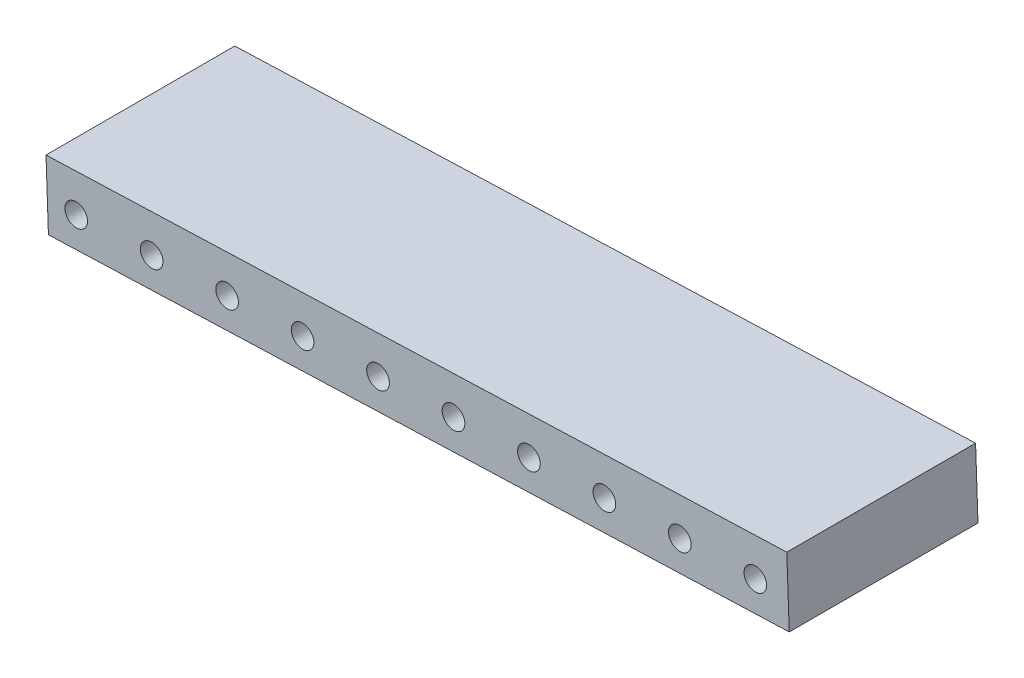
ISO-10303-21;
HEADER;
FILE_DESCRIPTION(('STEP AP214'),'2;1');
FILE_NAME('part.step','',(''),(''),'','','');
FILE_SCHEMA(('AUTOMOTIVE_DESIGN { 1 0 10303 214 1 1 1 1 }'));
ENDSEC;
DATA;
#1=APPLICATION_CONTEXT('core data for automotive mechanical design processes');
#2=APPLICATION_PROTOCOL_DEFINITION('international standard','automotive_design',2000,#1);
#3=PRODUCT_CONTEXT('',#1,'mechanical');
#4=PRODUCT('Part','Part','',(#3));
#5=PRODUCT_RELATED_PRODUCT_CATEGORY('part','',(#4));
#6=PRODUCT_DEFINITION_FORMATION('','',#4);
#7=PRODUCT_DEFINITION_CONTEXT('part definition',#1,'design');
#8=PRODUCT_DEFINITION('design','',#6,#7);
#9=PRODUCT_DEFINITION_SHAPE('','',#8);
#10=(LENGTH_UNIT() NAMED_UNIT(*) SI_UNIT(.MILLI.,.METRE.));
#11=(NAMED_UNIT(*) PLANE_ANGLE_UNIT() SI_UNIT($,.RADIAN.));
#12=(NAMED_UNIT(*) SI_UNIT($,.STERADIAN.) SOLID_ANGLE_UNIT());
#13=UNCERTAINTY_MEASURE_WITH_UNIT(LENGTH_MEASURE(1.E-05),#10,'distance_accuracy_value','');
#14=(GEOMETRIC_REPRESENTATION_CONTEXT(3) GLOBAL_UNCERTAINTY_ASSIGNED_CONTEXT((#13)) GLOBAL_UNIT_ASSIGNED_CONTEXT((#10,
#11,#12)) REPRESENTATION_CONTEXT('',''));
#15=CARTESIAN_POINT('',(0.,0.,0.));
#16=DIRECTION('',(0.,0.,1.));
#17=DIRECTION('',(1.,0.,0.));
#18=AXIS2_PLACEMENT_3D('',#15,#16,#17);
#19=CARTESIAN_POINT('',(-0.713375796178345,19.9745222929936,-5.));
#20=DIRECTION('',(-0.0356915305124125,0.99936285434755,0.));
#21=DIRECTION('',(-0.99936285434755,-0.0356915305124125,0.));
#22=AXIS2_PLACEMENT_3D('',#19,#20,#21);
#23=PLANE('',#22);
#24=DIRECTION('',(-0.99936285434755,-0.0356915305124125,0.));
#25=VECTOR('',#24,1.);
#26=CARTESIAN_POINT('',(-0.713375796178345,19.9745222929936,5.));
#27=LINE('',#26,#25);
#28=CARTESIAN_POINT('',(114.097813252607,24.0749219018788,5.));
#29=VERTEX_POINT('',#28);
#30=CARTESIAN_POINT('',(15.9876544347127,20.5709876583826,5.));
#31=VERTEX_POINT('',#30);
#32=EDGE_CURVE('E123',#29,#31,#27,.T.);
#33=ORIENTED_EDGE('',*,*,#32,.F.);
#34=DIRECTION('',(0.,0.,-1.));
#35=VECTOR('',#34,1.);
#36=CARTESIAN_POINT('',(114.097813252607,24.0749219018788,5.));
#37=LINE('',#36,#35);
#38=CARTESIAN_POINT('',(114.097813252607,24.0749219018788,-20.));
#39=VERTEX_POINT('',#38);
#40=EDGE_CURVE('E154',#29,#39,#37,.T.);
#41=ORIENTED_EDGE('',*,*,#40,.T.);
#42=DIRECTION('',(0.99936285434755,0.0356915305124126,0.));
#43=VECTOR('',#42,1.);
#44=CARTESIAN_POINT('',(15.9876544347127,20.5709876583826,-20.));
#45=LINE('',#44,#43);
#46=CARTESIAN_POINT('',(15.9876544347127,20.5709876583826,-20.));
#47=VERTEX_POINT('',#46);
#48=EDGE_CURVE('E228',#47,#39,#45,.T.);
#49=ORIENTED_EDGE('',*,*,#48,.F.);
#50=DIRECTION('',(0.,0.,1.));
#51=VECTOR('',#50,1.);
#52=CARTESIAN_POINT('',(15.9876544347127,20.5709876583826,0.));
#53=LINE('',#52,#51);
#54=EDGE_CURVE('E167',#47,#31,#53,.T.);
#55=ORIENTED_EDGE('',*,*,#54,.T.);
#56=EDGE_LOOP('',(#33,#41,#49,#55));
#57=FACE_BOUND('',#56,.T.);
#58=ADVANCED_FACE('F114',(#57),#23,.T.);
#59=CARTESIAN_POINT('',(-0.392152021566632,10.9802566038657,0.));
#60=DIRECTION('',(-0.0356915305124125,0.99936285434755,0.));
#61=DIRECTION('',(-0.99936285434755,-0.0356915305124125,0.));
#62=AXIS2_PLACEMENT_3D('',#59,#60,#61);
#63=PLANE('',#62);
#64=DIRECTION('',(0.,0.,-1.));
#65=VECTOR('',#64,1.);
#66=CARTESIAN_POINT('',(114.419037027218,15.0806562127509,5.));
#67=LINE('',#66,#65);
#68=CARTESIAN_POINT('',(114.419037027218,15.0806562127509,5.));
#69=VERTEX_POINT('',#68);
#70=CARTESIAN_POINT('',(114.419037027218,15.0806562127509,-20.));
#71=VERTEX_POINT('',#70);
#72=EDGE_CURVE('E130',#69,#71,#67,.T.);
#73=ORIENTED_EDGE('',*,*,#72,.F.);
#74=DIRECTION('',(-0.99936285434755,-0.0356915305124125,0.));
#75=VECTOR('',#74,1.);
#76=CARTESIAN_POINT('',(-0.392152021566632,10.9802566038657,5.));
#77=LINE('',#76,#75);
#78=CARTESIAN_POINT('',(16.3088782093244,11.5767219692547,5.));
#79=VERTEX_POINT('',#78);
#80=EDGE_CURVE('E163',#69,#79,#77,.T.);
#81=ORIENTED_EDGE('',*,*,#80,.T.);
#82=DIRECTION('',(0.,0.,1.));
#83=VECTOR('',#82,1.);
#84=CARTESIAN_POINT('',(16.3088782093244,11.5767219692547,0.));
#85=LINE('',#84,#83);
#86=CARTESIAN_POINT('',(16.3088782093244,11.5767219692547,-20.));
#87=VERTEX_POINT('',#86);
#88=EDGE_CURVE('E210',#87,#79,#85,.T.);
#89=ORIENTED_EDGE('',*,*,#88,.F.);
#90=DIRECTION('',(-0.99936285434755,-0.0356915305124126,0.));
#91=VECTOR('',#90,1.);
#92=CARTESIAN_POINT('',(134.406294114169,15.7944868229991,-20.));
#93=LINE('',#92,#91);
#94=EDGE_CURVE('E225',#71,#87,#93,.T.);
#95=ORIENTED_EDGE('',*,*,#94,.F.);
#96=EDGE_LOOP('',(#73,#81,#89,#95));
#97=FACE_BOUND('',#96,.T.);
#98=ADVANCED_FACE('F305',(#97),#63,.F.);
#99=CARTESIAN_POINT('',(0.,0.,5.));
#100=DIRECTION('',(0.,0.,1.));
#101=DIRECTION('',(1.,0.,0.));
#102=AXIS2_PLACEMENT_3D('',#99,#100,#101);
#103=PLANE('',#102);
#104=CARTESIAN_POINT('',(109.92991397823,18.9260683563654,5.));
#105=DIRECTION('',(0.,0.,1.));
#106=DIRECTION('',(1.,0.,0.));
#107=AXIS2_PLACEMENT_3D('',#104,#105,#106);
#108=CIRCLE('',#107,1.5);
#109=CARTESIAN_POINT('',(111.42991397823,18.9260683563654,5.));
#110=VERTEX_POINT('',#109);
#111=EDGE_CURVE('E175',#110,#110,#108,.T.);
#112=ORIENTED_EDGE('',*,*,#111,.F.);
#113=EDGE_LOOP('',(#112));
#114=FACE_BOUND('',#113,.T.);
#115=CARTESIAN_POINT('',(99.936285434755,18.5691530512413,5.));
#116=DIRECTION('',(0.,0.,1.));
#117=DIRECTION('',(1.,0.,0.));
#118=AXIS2_PLACEMENT_3D('',#115,#116,#117);
#119=CIRCLE('',#118,1.5);
#120=CARTESIAN_POINT('',(101.436285434755,18.5691530512413,5.));
#121=VERTEX_POINT('',#120);
#122=EDGE_CURVE('E179',#121,#121,#119,.T.);
#123=ORIENTED_EDGE('',*,*,#122,.F.);
#124=EDGE_LOOP('',(#123));
#125=FACE_BOUND('',#124,.T.);
#126=CARTESIAN_POINT('',(59.961771260853,17.1414918307447,5.));
#127=DIRECTION('',(0.,0.,1.));
#128=DIRECTION('',(1.,0.,0.));
#129=AXIS2_PLACEMENT_3D('',#126,#127,#128);
#130=CIRCLE('',#129,1.5);
#131=CARTESIAN_POINT('',(61.461771260853,17.1414918307447,5.));
#132=VERTEX_POINT('',#131);
#133=EDGE_CURVE('E172',#132,#132,#130,.T.);
#134=ORIENTED_EDGE('',*,*,#133,.F.);
#135=EDGE_LOOP('',(#134));
#136=FACE_BOUND('',#135,.T.);
#137=CARTESIAN_POINT('',(69.9553998043285,17.4984071358689,5.));
#138=DIRECTION('',(0.,0.,1.));
#139=DIRECTION('',(1.,0.,0.));
#140=AXIS2_PLACEMENT_3D('',#137,#138,#139);
#141=CIRCLE('',#140,1.5);
#142=CARTESIAN_POINT('',(71.4553998043285,17.4984071358689,5.));
#143=VERTEX_POINT('',#142);
#144=EDGE_CURVE('E188',#143,#143,#141,.T.);
#145=ORIENTED_EDGE('',*,*,#144,.F.);
#146=EDGE_LOOP('',(#145));
#147=FACE_BOUND('',#146,.T.);
#148=CARTESIAN_POINT('',(19.987257086951,15.7138306102482,5.));
#149=DIRECTION('',(0.,0.,1.));
#150=DIRECTION('',(1.,0.,0.));
#151=AXIS2_PLACEMENT_3D('',#148,#149,#150);
#152=CIRCLE('',#151,1.5);
#153=CARTESIAN_POINT('',(21.487257086951,15.7138306102482,5.));
#154=VERTEX_POINT('',#153);
#155=EDGE_CURVE('E184',#154,#154,#152,.T.);
#156=ORIENTED_EDGE('',*,*,#155,.F.);
#157=EDGE_LOOP('',(#156));
#158=FACE_BOUND('',#157,.T.);
#159=CARTESIAN_POINT('',(29.9808856304265,16.0707459153724,5.));
#160=DIRECTION('',(0.,0.,1.));
#161=DIRECTION('',(1.,0.,0.));
#162=AXIS2_PLACEMENT_3D('',#159,#160,#161);
#163=CIRCLE('',#162,1.5);
#164=CARTESIAN_POINT('',(31.4808856304265,16.0707459153724,5.));
#165=VERTEX_POINT('',#164);
#166=EDGE_CURVE('E189',#165,#165,#163,.T.);
#167=ORIENTED_EDGE('',*,*,#166,.F.);
#168=EDGE_LOOP('',(#167));
#169=FACE_BOUND('',#168,.T.);
#170=CARTESIAN_POINT('',(39.974514173902,16.4276612204965,5.));
#171=DIRECTION('',(0.,0.,1.));
#172=DIRECTION('',(1.,0.,0.));
#173=AXIS2_PLACEMENT_3D('',#170,#171,#172);
#174=CIRCLE('',#173,1.5);
#175=CARTESIAN_POINT('',(41.474514173902,16.4276612204965,5.));
#176=VERTEX_POINT('',#175);
#177=EDGE_CURVE('E203',#176,#176,#174,.T.);
#178=ORIENTED_EDGE('',*,*,#177,.F.);
#179=EDGE_LOOP('',(#178));
#180=FACE_BOUND('',#179,.T.);
#181=CARTESIAN_POINT('',(79.949028347804,17.855322440993,5.));
#182=DIRECTION('',(0.,0.,1.));
#183=DIRECTION('',(1.,0.,0.));
#184=AXIS2_PLACEMENT_3D('',#181,#182,#183);
#185=CIRCLE('',#184,1.5);
#186=CARTESIAN_POINT('',(81.449028347804,17.855322440993,5.));
#187=VERTEX_POINT('',#186);
#188=EDGE_CURVE('E199',#187,#187,#185,.T.);
#189=ORIENTED_EDGE('',*,*,#188,.F.);
#190=EDGE_LOOP('',(#189));
#191=FACE_BOUND('',#190,.T.);
#192=CARTESIAN_POINT('',(89.9426568912795,18.2122377461171,5.));
#193=DIRECTION('',(0.,0.,1.));
#194=DIRECTION('',(1.,0.,0.));
#195=AXIS2_PLACEMENT_3D('',#192,#193,#194);
#196=CIRCLE('',#195,1.5);
#197=CARTESIAN_POINT('',(91.4426568912795,18.2122377461171,5.));
#198=VERTEX_POINT('',#197);
#199=EDGE_CURVE('E183',#198,#198,#196,.T.);
#200=ORIENTED_EDGE('',*,*,#199,.F.);
#201=EDGE_LOOP('',(#200));
#202=FACE_BOUND('',#201,.T.);
#203=CARTESIAN_POINT('',(49.9681427173775,16.7845765256206,5.));
#204=DIRECTION('',(0.,0.,1.));
#205=DIRECTION('',(1.,0.,0.));
#206=AXIS2_PLACEMENT_3D('',#203,#204,#205);
#207=CIRCLE('',#206,1.5);
#208=CARTESIAN_POINT('',(51.4681427173775,16.7845765256206,5.));
#209=VERTEX_POINT('',#208);
#210=EDGE_CURVE('E169',#209,#209,#207,.T.);
#211=ORIENTED_EDGE('',*,*,#210,.F.);
#212=EDGE_LOOP('',(#211));
#213=FACE_BOUND('',#212,.T.);
#214=ORIENTED_EDGE('',*,*,#80,.F.);
#215=DIRECTION('',(0.03569153051241,-0.99936285434755,0.));
#216=VECTOR('',#215,1.);
#217=CARTESIAN_POINT('',(114.811189048785,4.10039960888489,5.));
#218=LINE('',#217,#216);
#219=EDGE_CURVE('E156',#29,#69,#218,.T.);
#220=ORIENTED_EDGE('',*,*,#219,.F.);
#221=ORIENTED_EDGE('',*,*,#32,.T.);
#222=DIRECTION('',(-0.0356915305124123,0.99936285434755,0.));
#223=VECTOR('',#222,1.);
#224=CARTESIAN_POINT('',(16.701030230891,0.596465365388962,5.));
#225=LINE('',#224,#223);
#226=EDGE_CURVE('E214',#79,#31,#225,.T.);
#227=ORIENTED_EDGE('',*,*,#226,.F.);
#228=EDGE_LOOP('',(#214,#220,#221,#227));
#229=FACE_BOUND('',#228,.T.);
#230=ADVANCED_FACE('F116',(#114,#125,#136,#147,#158,#169,#180,#191,#202,#213,#229),#103,.T.);
#231=CARTESIAN_POINT('',(0.,0.,-20.));
#232=DIRECTION('',(0.,0.,-1.));
#233=DIRECTION('',(-1.,0.,0.));
#234=AXIS2_PLACEMENT_3D('',#231,#232,#233);
#235=PLANE('',#234);
#236=CARTESIAN_POINT('',(19.987257086951,15.7138306102483,-20.));
#237=DIRECTION('',(0.,0.,-1.));
#238=DIRECTION('',(-1.,0.,0.));
#239=AXIS2_PLACEMENT_3D('',#236,#237,#238);
#240=CIRCLE('',#239,1.5);
#241=CARTESIAN_POINT('',(18.487257086951,15.7138306102483,-20.));
#242=VERTEX_POINT('',#241);
#243=EDGE_CURVE('E267',#242,#242,#240,.T.);
#244=ORIENTED_EDGE('',*,*,#243,.F.);
#245=EDGE_LOOP('',(#244));
#246=FACE_BOUND('',#245,.T.);
#247=CARTESIAN_POINT('',(39.974514173902,16.4276612204965,-20.));
#248=DIRECTION('',(0.,0.,-1.));
#249=DIRECTION('',(-1.,0.,0.));
#250=AXIS2_PLACEMENT_3D('',#247,#248,#249);
#251=CIRCLE('',#250,1.5);
#252=CARTESIAN_POINT('',(38.474514173902,16.4276612204965,-20.));
#253=VERTEX_POINT('',#252);
#254=EDGE_CURVE('E259',#253,#253,#251,.T.);
#255=ORIENTED_EDGE('',*,*,#254,.F.);
#256=EDGE_LOOP('',(#255));
#257=FACE_BOUND('',#256,.T.);
#258=CARTESIAN_POINT('',(59.961771260853,17.1414918307448,-20.));
#259=DIRECTION('',(0.,0.,-1.));
#260=DIRECTION('',(-1.,0.,0.));
#261=AXIS2_PLACEMENT_3D('',#258,#259,#260);
#262=CIRCLE('',#261,1.5);
#263=CARTESIAN_POINT('',(58.461771260853,17.1414918307448,-20.));
#264=VERTEX_POINT('',#263);
#265=EDGE_CURVE('E251',#264,#264,#262,.T.);
#266=ORIENTED_EDGE('',*,*,#265,.F.);
#267=EDGE_LOOP('',(#266));
#268=FACE_BOUND('',#267,.T.);
#269=CARTESIAN_POINT('',(79.949028347804,17.855322440993,-20.));
#270=DIRECTION('',(0.,0.,-1.));
#271=DIRECTION('',(-1.,0.,0.));
#272=AXIS2_PLACEMENT_3D('',#269,#270,#271);
#273=CIRCLE('',#272,1.5);
#274=CARTESIAN_POINT('',(78.449028347804,17.855322440993,-20.));
#275=VERTEX_POINT('',#274);
#276=EDGE_CURVE('E243',#275,#275,#273,.T.);
#277=ORIENTED_EDGE('',*,*,#276,.F.);
#278=EDGE_LOOP('',(#277));
#279=FACE_BOUND('',#278,.T.);
#280=CARTESIAN_POINT('',(99.936285434755,18.5691530512413,-20.));
#281=DIRECTION('',(0.,0.,-1.));
#282=DIRECTION('',(-1.,0.,0.));
#283=AXIS2_PLACEMENT_3D('',#280,#281,#282);
#284=CIRCLE('',#283,1.5);
#285=CARTESIAN_POINT('',(98.436285434755,18.5691530512413,-20.));
#286=VERTEX_POINT('',#285);
#287=EDGE_CURVE('E235',#286,#286,#284,.T.);
#288=ORIENTED_EDGE('',*,*,#287,.F.);
#289=EDGE_LOOP('',(#288));
#290=FACE_BOUND('',#289,.T.);
#291=CARTESIAN_POINT('',(109.92991397823,18.9260683563654,-20.));
#292=DIRECTION('',(0.,0.,-1.));
#293=DIRECTION('',(-1.,0.,0.));
#294=AXIS2_PLACEMENT_3D('',#291,#292,#293);
#295=CIRCLE('',#294,1.5);
#296=CARTESIAN_POINT('',(108.42991397823,18.9260683563654,-20.));
#297=VERTEX_POINT('',#296);
#298=EDGE_CURVE('E231',#297,#297,#295,.T.);
#299=ORIENTED_EDGE('',*,*,#298,.F.);
#300=EDGE_LOOP('',(#299));
#301=FACE_BOUND('',#300,.T.);
#302=CARTESIAN_POINT('',(89.9426568912795,18.2122377461171,-20.));
#303=DIRECTION('',(0.,0.,-1.));
#304=DIRECTION('',(-1.,0.,0.));
#305=AXIS2_PLACEMENT_3D('',#302,#303,#304);
#306=CIRCLE('',#305,1.5);
#307=CARTESIAN_POINT('',(88.4426568912795,18.2122377461171,-20.));
#308=VERTEX_POINT('',#307);
#309=EDGE_CURVE('E239',#308,#308,#306,.T.);
#310=ORIENTED_EDGE('',*,*,#309,.F.);
#311=EDGE_LOOP('',(#310));
#312=FACE_BOUND('',#311,.T.);
#313=CARTESIAN_POINT('',(69.9553998043285,17.4984071358689,-20.));
#314=DIRECTION('',(0.,0.,-1.));
#315=DIRECTION('',(-1.,0.,0.));
#316=AXIS2_PLACEMENT_3D('',#313,#314,#315);
#317=CIRCLE('',#316,1.5);
#318=CARTESIAN_POINT('',(68.4553998043285,17.4984071358689,-20.));
#319=VERTEX_POINT('',#318);
#320=EDGE_CURVE('E247',#319,#319,#317,.T.);
#321=ORIENTED_EDGE('',*,*,#320,.F.);
#322=EDGE_LOOP('',(#321));
#323=FACE_BOUND('',#322,.T.);
#324=CARTESIAN_POINT('',(49.9681427173775,16.7845765256206,-20.));
#325=DIRECTION('',(0.,0.,-1.));
#326=DIRECTION('',(-1.,0.,0.));
#327=AXIS2_PLACEMENT_3D('',#324,#325,#326);
#328=CIRCLE('',#327,1.5);
#329=CARTESIAN_POINT('',(48.4681427173775,16.7845765256206,-20.));
#330=VERTEX_POINT('',#329);
#331=EDGE_CURVE('E255',#330,#330,#328,.T.);
#332=ORIENTED_EDGE('',*,*,#331,.F.);
#333=EDGE_LOOP('',(#332));
#334=FACE_BOUND('',#333,.T.);
#335=CARTESIAN_POINT('',(29.9808856304265,16.0707459153724,-20.));
#336=DIRECTION('',(0.,0.,-1.));
#337=DIRECTION('',(-1.,0.,0.));
#338=AXIS2_PLACEMENT_3D('',#335,#336,#337);
#339=CIRCLE('',#338,1.5);
#340=CARTESIAN_POINT('',(28.4808856304265,16.0707459153724,-20.));
#341=VERTEX_POINT('',#340);
#342=EDGE_CURVE('E263',#341,#341,#339,.T.);
#343=ORIENTED_EDGE('',*,*,#342,.F.);
#344=EDGE_LOOP('',(#343));
#345=FACE_BOUND('',#344,.T.);
#346=ORIENTED_EDGE('',*,*,#48,.T.);
#347=DIRECTION('',(0.0356915305124099,-0.99936285434755,0.));
#348=VECTOR('',#347,1.);
#349=CARTESIAN_POINT('',(114.811189048785,4.10039960888489,-20.));
#350=LINE('',#349,#348);
#351=EDGE_CURVE('E12',#39,#71,#350,.T.);
#352=ORIENTED_EDGE('',*,*,#351,.T.);
#353=ORIENTED_EDGE('',*,*,#94,.T.);
#354=DIRECTION('',(-0.0356915305124127,0.99936285434755,0.));
#355=VECTOR('',#354,1.);
#356=CARTESIAN_POINT('',(16.3088782093244,11.5767219692547,-20.));
#357=LINE('',#356,#355);
#358=EDGE_CURVE('E221',#87,#47,#357,.T.);
#359=ORIENTED_EDGE('',*,*,#358,.T.);
#360=EDGE_LOOP('',(#346,#352,#353,#359));
#361=FACE_BOUND('',#360,.T.);
#362=ADVANCED_FACE('F276',(#246,#257,#268,#279,#290,#301,#312,#323,#334,#345,#361),#235,.T.);
#363=CARTESIAN_POINT('',(49.9681427173775,16.7845765256206,0.));
#364=DIRECTION('',(0.,0.,1.));
#365=DIRECTION('',(1.,0.,0.));
#366=AXIS2_PLACEMENT_3D('',#363,#364,#365);
#367=CYLINDRICAL_SURFACE('',#366,1.5);
#368=ORIENTED_EDGE('',*,*,#210,.T.);
#369=EDGE_LOOP('',(#368));
#370=FACE_BOUND('',#369,.T.);
#371=ORIENTED_EDGE('',*,*,#331,.T.);
#372=EDGE_LOOP('',(#371));
#373=FACE_BOUND('',#372,.T.);
#374=ADVANCED_FACE('F279',(#370,#373),#367,.F.);
#375=CARTESIAN_POINT('',(89.9426568912795,18.2122377461171,0.));
#376=DIRECTION('',(0.,0.,1.));
#377=DIRECTION('',(1.,0.,0.));
#378=AXIS2_PLACEMENT_3D('',#375,#376,#377);
#379=CYLINDRICAL_SURFACE('',#378,1.5);
#380=ORIENTED_EDGE('',*,*,#199,.T.);
#381=EDGE_LOOP('',(#380));
#382=FACE_BOUND('',#381,.T.);
#383=ORIENTED_EDGE('',*,*,#309,.T.);
#384=EDGE_LOOP('',(#383));
#385=FACE_BOUND('',#384,.T.);
#386=ADVANCED_FACE('F326',(#382,#385),#379,.F.);
#387=CARTESIAN_POINT('',(79.949028347804,17.855322440993,0.));
#388=DIRECTION('',(0.,0.,1.));
#389=DIRECTION('',(1.,0.,0.));
#390=AXIS2_PLACEMENT_3D('',#387,#388,#389);
#391=CYLINDRICAL_SURFACE('',#390,1.5);
#392=ORIENTED_EDGE('',*,*,#188,.T.);
#393=EDGE_LOOP('',(#392));
#394=FACE_BOUND('',#393,.T.);
#395=ORIENTED_EDGE('',*,*,#276,.T.);
#396=EDGE_LOOP('',(#395));
#397=FACE_BOUND('',#396,.T.);
#398=ADVANCED_FACE('F322',(#394,#397),#391,.F.);
#399=CARTESIAN_POINT('',(39.974514173902,16.4276612204965,0.));
#400=DIRECTION('',(0.,0.,1.));
#401=DIRECTION('',(1.,0.,0.));
#402=AXIS2_PLACEMENT_3D('',#399,#400,#401);
#403=CYLINDRICAL_SURFACE('',#402,1.5);
#404=ORIENTED_EDGE('',*,*,#177,.T.);
#405=EDGE_LOOP('',(#404));
#406=FACE_BOUND('',#405,.T.);
#407=ORIENTED_EDGE('',*,*,#254,.T.);
#408=EDGE_LOOP('',(#407));
#409=FACE_BOUND('',#408,.T.);
#410=ADVANCED_FACE('F318',(#406,#409),#403,.F.);
#411=CARTESIAN_POINT('',(29.9808856304265,16.0707459153724,0.));
#412=DIRECTION('',(0.,0.,1.));
#413=DIRECTION('',(1.,0.,0.));
#414=AXIS2_PLACEMENT_3D('',#411,#412,#413);
#415=CYLINDRICAL_SURFACE('',#414,1.5);
#416=ORIENTED_EDGE('',*,*,#166,.T.);
#417=EDGE_LOOP('',(#416));
#418=FACE_BOUND('',#417,.T.);
#419=ORIENTED_EDGE('',*,*,#342,.T.);
#420=EDGE_LOOP('',(#419));
#421=FACE_BOUND('',#420,.T.);
#422=ADVANCED_FACE('F315',(#418,#421),#415,.F.);
#423=CARTESIAN_POINT('',(19.987257086951,15.7138306102482,0.));
#424=DIRECTION('',(0.,0.,1.));
#425=DIRECTION('',(1.,0.,0.));
#426=AXIS2_PLACEMENT_3D('',#423,#424,#425);
#427=CYLINDRICAL_SURFACE('',#426,1.5);
#428=ORIENTED_EDGE('',*,*,#155,.T.);
#429=EDGE_LOOP('',(#428));
#430=FACE_BOUND('',#429,.T.);
#431=ORIENTED_EDGE('',*,*,#243,.T.);
#432=EDGE_LOOP('',(#431));
#433=FACE_BOUND('',#432,.T.);
#434=ADVANCED_FACE('F274',(#430,#433),#427,.F.);
#435=CARTESIAN_POINT('',(69.9553998043285,17.4984071358689,0.));
#436=DIRECTION('',(0.,0.,1.));
#437=DIRECTION('',(1.,0.,0.));
#438=AXIS2_PLACEMENT_3D('',#435,#436,#437);
#439=CYLINDRICAL_SURFACE('',#438,1.5);
#440=ORIENTED_EDGE('',*,*,#144,.T.);
#441=EDGE_LOOP('',(#440));
#442=FACE_BOUND('',#441,.T.);
#443=ORIENTED_EDGE('',*,*,#320,.T.);
#444=EDGE_LOOP('',(#443));
#445=FACE_BOUND('',#444,.T.);
#446=ADVANCED_FACE('F335',(#442,#445),#439,.F.);
#447=CARTESIAN_POINT('',(59.961771260853,17.1414918307447,0.));
#448=DIRECTION('',(0.,0.,1.));
#449=DIRECTION('',(1.,0.,0.));
#450=AXIS2_PLACEMENT_3D('',#447,#448,#449);
#451=CYLINDRICAL_SURFACE('',#450,1.5);
#452=ORIENTED_EDGE('',*,*,#133,.T.);
#453=EDGE_LOOP('',(#452));
#454=FACE_BOUND('',#453,.T.);
#455=ORIENTED_EDGE('',*,*,#265,.T.);
#456=EDGE_LOOP('',(#455));
#457=FACE_BOUND('',#456,.T.);
#458=ADVANCED_FACE('F331',(#454,#457),#451,.F.);
#459=CARTESIAN_POINT('',(99.936285434755,18.5691530512413,0.));
#460=DIRECTION('',(0.,0.,1.));
#461=DIRECTION('',(1.,0.,0.));
#462=AXIS2_PLACEMENT_3D('',#459,#460,#461);
#463=CYLINDRICAL_SURFACE('',#462,1.5);
#464=ORIENTED_EDGE('',*,*,#122,.T.);
#465=EDGE_LOOP('',(#464));
#466=FACE_BOUND('',#465,.T.);
#467=ORIENTED_EDGE('',*,*,#287,.T.);
#468=EDGE_LOOP('',(#467));
#469=FACE_BOUND('',#468,.T.);
#470=ADVANCED_FACE('F334',(#466,#469),#463,.F.);
#471=CARTESIAN_POINT('',(109.92991397823,18.9260683563654,0.));
#472=DIRECTION('',(0.,0.,1.));
#473=DIRECTION('',(1.,0.,0.));
#474=AXIS2_PLACEMENT_3D('',#471,#472,#473);
#475=CYLINDRICAL_SURFACE('',#474,1.5);
#476=ORIENTED_EDGE('',*,*,#111,.T.);
#477=EDGE_LOOP('',(#476));
#478=FACE_BOUND('',#477,.T.);
#479=ORIENTED_EDGE('',*,*,#298,.T.);
#480=EDGE_LOOP('',(#479));
#481=FACE_BOUND('',#480,.T.);
#482=ADVANCED_FACE('F345',(#478,#481),#475,.F.);
#483=CARTESIAN_POINT('',(16.701030230891,0.596465365388962,0.));
#484=DIRECTION('',(0.99936285434755,0.0356915305124123,0.));
#485=DIRECTION('',(-0.0356915305124123,0.99936285434755,0.));
#486=AXIS2_PLACEMENT_3D('',#483,#484,#485);
#487=PLANE('',#486);
#488=ORIENTED_EDGE('',*,*,#226,.T.);
#489=ORIENTED_EDGE('',*,*,#54,.F.);
#490=ORIENTED_EDGE('',*,*,#358,.F.);
#491=ORIENTED_EDGE('',*,*,#88,.T.);
#492=EDGE_LOOP('',(#488,#489,#490,#491));
#493=FACE_BOUND('',#492,.T.);
#494=ADVANCED_FACE('F303',(#493),#487,.F.);
#495=CARTESIAN_POINT('',(114.811189048785,4.10039960888489,5.));
#496=DIRECTION('',(0.99936285434755,0.0356915305124099,0.));
#497=DIRECTION('',(-0.0356915305124099,0.99936285434755,0.));
#498=AXIS2_PLACEMENT_3D('',#495,#496,#497);
#499=PLANE('',#498);
#500=ORIENTED_EDGE('',*,*,#40,.F.);
#501=ORIENTED_EDGE('',*,*,#219,.T.);
#502=ORIENTED_EDGE('',*,*,#72,.T.);
#503=ORIENTED_EDGE('',*,*,#351,.F.);
#504=EDGE_LOOP('',(#500,#501,#502,#503));
#505=FACE_BOUND('',#504,.T.);
#506=ADVANCED_FACE('F155',(#505),#499,.T.);
#507=CLOSED_SHELL('',(#58,#98,#230,#362,#374,#386,#398,#410,#422,#434,#446,#458,#470,#482,#494,#506));
#508=MANIFOLD_SOLID_BREP('B2',#507);
#509=ADVANCED_BREP_SHAPE_REPRESENTATION('',(#18,#508),#14);
#510=SHAPE_DEFINITION_REPRESENTATION(#9,#509);
ENDSEC;
END-ISO-10303-21;
